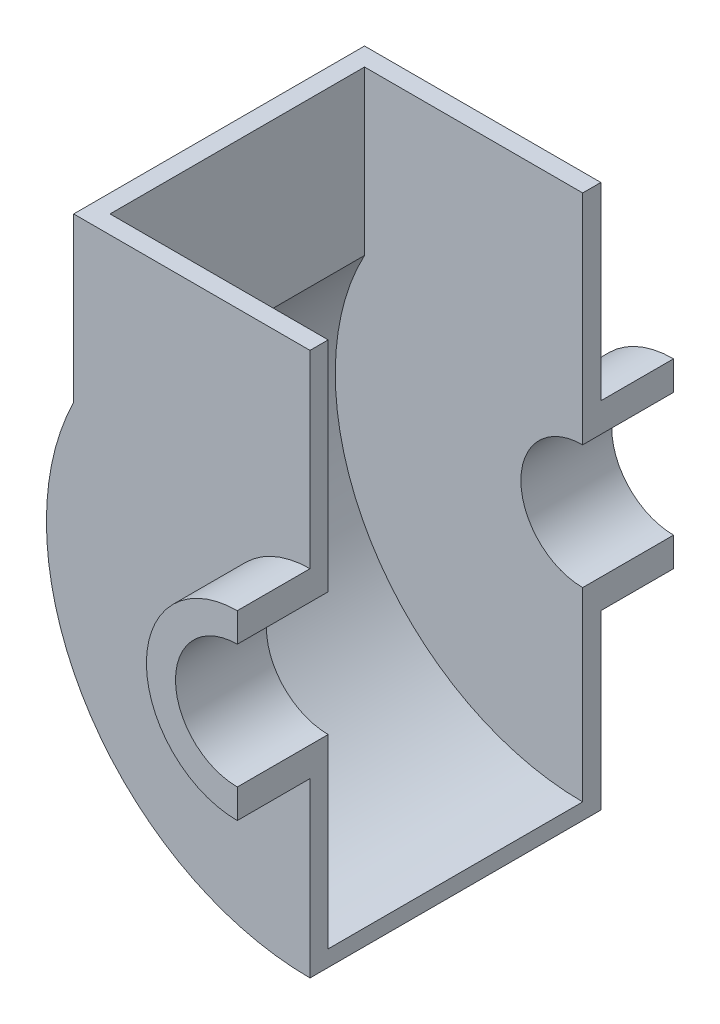
ISO-10303-21;
HEADER;
FILE_DESCRIPTION(('STEP AP214'),'2;1');
FILE_NAME('part.step','',(''),(''),'','','');
FILE_SCHEMA(('AUTOMOTIVE_DESIGN { 1 0 10303 214 1 1 1 1 }'));
ENDSEC;
DATA;
#1=APPLICATION_CONTEXT('core data for automotive mechanical design processes');
#2=APPLICATION_PROTOCOL_DEFINITION('international standard','automotive_design',2000,#1);
#3=PRODUCT_CONTEXT('',#1,'mechanical');
#4=PRODUCT('Part','Part','',(#3));
#5=PRODUCT_RELATED_PRODUCT_CATEGORY('part','',(#4));
#6=PRODUCT_DEFINITION_FORMATION('','',#4);
#7=PRODUCT_DEFINITION_CONTEXT('part definition',#1,'design');
#8=PRODUCT_DEFINITION('design','',#6,#7);
#9=PRODUCT_DEFINITION_SHAPE('','',#8);
#10=(LENGTH_UNIT() NAMED_UNIT(*) SI_UNIT(.MILLI.,.METRE.));
#11=(NAMED_UNIT(*) PLANE_ANGLE_UNIT() SI_UNIT($,.RADIAN.));
#12=(NAMED_UNIT(*) SI_UNIT($,.STERADIAN.) SOLID_ANGLE_UNIT());
#13=UNCERTAINTY_MEASURE_WITH_UNIT(LENGTH_MEASURE(1.E-05),#10,'distance_accuracy_value','');
#14=(GEOMETRIC_REPRESENTATION_CONTEXT(3) GLOBAL_UNCERTAINTY_ASSIGNED_CONTEXT((#13)) GLOBAL_UNIT_ASSIGNED_CONTEXT((#10,
#11,#12)) REPRESENTATION_CONTEXT('',''));
#15=CARTESIAN_POINT('',(0.,0.,0.));
#16=DIRECTION('',(0.,0.,1.));
#17=DIRECTION('',(1.,0.,0.));
#18=AXIS2_PLACEMENT_3D('',#15,#16,#17);
#19=CARTESIAN_POINT('',(0.,0.,-5.));
#20=DIRECTION('',(0.,0.,1.));
#21=DIRECTION('',(1.,0.,0.));
#22=AXIS2_PLACEMENT_3D('',#19,#20,#21);
#23=PLANE('',#22);
#24=CARTESIAN_POINT('',(0.,0.,-5.));
#25=DIRECTION('',(0.,0.,1.));
#26=DIRECTION('',(-1.,0.,0.));
#27=AXIS2_PLACEMENT_3D('',#24,#25,#26);
#28=CIRCLE('',#27,68.053287944081);
#29=CARTESIAN_POINT('',(-60.,32.1130814466628,-5.));
#30=VERTEX_POINT('',#29);
#31=CARTESIAN_POINT('',(0.,-68.053287944081,-5.));
#32=VERTEX_POINT('',#31);
#33=EDGE_CURVE('E196',#30,#32,#28,.T.);
#34=ORIENTED_EDGE('',*,*,#33,.F.);
#35=DIRECTION('',(0.,-1.,0.));
#36=VECTOR('',#35,1.);
#37=CARTESIAN_POINT('',(-60.,77.,-5.));
#38=LINE('',#37,#36);
#39=CARTESIAN_POINT('',(-60.,77.,-5.));
#40=VERTEX_POINT('',#39);
#41=EDGE_CURVE('E53',#40,#30,#38,.T.);
#42=ORIENTED_EDGE('',*,*,#41,.F.);
#43=DIRECTION('',(-1.,0.,0.));
#44=VECTOR('',#43,1.);
#45=CARTESIAN_POINT('',(0.,77.,-5.));
#46=LINE('',#45,#44);
#47=CARTESIAN_POINT('',(0.,77.,-5.));
#48=VERTEX_POINT('',#47);
#49=EDGE_CURVE('E212',#48,#40,#46,.T.);
#50=ORIENTED_EDGE('',*,*,#49,.F.);
#51=DIRECTION('',(0.,1.,0.));
#52=VECTOR('',#51,1.);
#53=CARTESIAN_POINT('',(0.,25.,-5.));
#54=LINE('',#53,#52);
#55=CARTESIAN_POINT('',(0.,17.,-5.));
#56=VERTEX_POINT('',#55);
#57=EDGE_CURVE('E253',#56,#48,#54,.T.);
#58=ORIENTED_EDGE('',*,*,#57,.F.);
#59=CARTESIAN_POINT('',(0.,0.,-5.));
#60=DIRECTION('',(0.,0.,-1.));
#61=DIRECTION('',(1.,0.,0.));
#62=AXIS2_PLACEMENT_3D('',#59,#60,#61);
#63=CIRCLE('',#62,17.);
#64=CARTESIAN_POINT('',(0.,-17.,-5.));
#65=VERTEX_POINT('',#64);
#66=EDGE_CURVE('E250',#65,#56,#63,.T.);
#67=ORIENTED_EDGE('',*,*,#66,.F.);
#68=DIRECTION('',(0.,1.,0.));
#69=VECTOR('',#68,1.);
#70=CARTESIAN_POINT('',(0.,-17.,-5.));
#71=LINE('',#70,#69);
#72=EDGE_CURVE('E59',#32,#65,#71,.T.);
#73=ORIENTED_EDGE('',*,*,#72,.F.);
#74=EDGE_LOOP('',(#34,#42,#50,#58,#67,#73));
#75=FACE_BOUND('',#74,.T.);
#76=ADVANCED_FACE('F36',(#75),#23,.F.);
#77=CARTESIAN_POINT('',(0.,0.,-5.));
#78=DIRECTION('',(0.,0.,1.));
#79=DIRECTION('',(1.,0.,0.));
#80=AXIS2_PLACEMENT_3D('',#77,#78,#79);
#81=CYLINDRICAL_SURFACE('',#80,17.);
#82=DIRECTION('',(0.,0.,1.));
#83=VECTOR('',#82,1.);
#84=CARTESIAN_POINT('',(0.,17.,-5.));
#85=LINE('',#84,#83);
#86=CARTESIAN_POINT('',(0.,17.,20.));
#87=VERTEX_POINT('',#86);
#88=EDGE_CURVE('E40',#56,#87,#85,.T.);
#89=ORIENTED_EDGE('',*,*,#88,.T.);
#90=CARTESIAN_POINT('',(0.,0.,20.));
#91=DIRECTION('',(0.,0.,-1.));
#92=DIRECTION('',(1.,0.,0.));
#93=AXIS2_PLACEMENT_3D('',#90,#91,#92);
#94=CIRCLE('',#93,17.);
#95=CARTESIAN_POINT('',(0.,-17.,20.));
#96=VERTEX_POINT('',#95);
#97=EDGE_CURVE('E233',#96,#87,#94,.T.);
#98=ORIENTED_EDGE('',*,*,#97,.F.);
#99=DIRECTION('',(0.,0.,1.));
#100=VECTOR('',#99,1.);
#101=CARTESIAN_POINT('',(0.,-17.,-5.));
#102=LINE('',#101,#100);
#103=EDGE_CURVE('E11',#65,#96,#102,.T.);
#104=ORIENTED_EDGE('',*,*,#103,.F.);
#105=ORIENTED_EDGE('',*,*,#66,.T.);
#106=EDGE_LOOP('',(#89,#98,#104,#105));
#107=FACE_BOUND('',#106,.T.);
#108=ADVANCED_FACE('F38',(#107),#81,.F.);
#109=CARTESIAN_POINT('',(0.,-17.,-5.));
#110=DIRECTION('',(1.,0.,0.));
#111=DIRECTION('',(0.,0.,-1.));
#112=AXIS2_PLACEMENT_3D('',#109,#110,#111);
#113=PLANE('',#112);
#114=ORIENTED_EDGE('',*,*,#103,.T.);
#115=DIRECTION('',(0.,1.,0.));
#116=VECTOR('',#115,1.);
#117=CARTESIAN_POINT('',(0.,-17.,20.));
#118=LINE('',#117,#116);
#119=CARTESIAN_POINT('',(0.,-25.,20.));
#120=VERTEX_POINT('',#119);
#121=EDGE_CURVE('E247',#120,#96,#118,.T.);
#122=ORIENTED_EDGE('',*,*,#121,.F.);
#123=DIRECTION('',(0.,0.,1.));
#124=VECTOR('',#123,1.);
#125=CARTESIAN_POINT('',(0.,-25.,-5.));
#126=LINE('',#125,#124);
#127=CARTESIAN_POINT('',(0.,-25.,0.));
#128=VERTEX_POINT('',#127);
#129=EDGE_CURVE('E45',#128,#120,#126,.T.);
#130=ORIENTED_EDGE('',*,*,#129,.F.);
#131=DIRECTION('',(0.,-1.,0.));
#132=VECTOR('',#131,1.);
#133=CARTESIAN_POINT('',(0.,0.,0.));
#134=LINE('',#133,#132);
#135=CARTESIAN_POINT('',(0.,-72.5,0.));
#136=VERTEX_POINT('',#135);
#137=EDGE_CURVE('E215',#128,#136,#134,.T.);
#138=ORIENTED_EDGE('',*,*,#137,.T.);
#139=DIRECTION('',(0.,0.,1.));
#140=VECTOR('',#139,1.);
#141=CARTESIAN_POINT('',(0.,-72.5,-5.));
#142=LINE('',#141,#140);
#143=CARTESIAN_POINT('',(0.,-72.5,-80.));
#144=VERTEX_POINT('',#143);
#145=EDGE_CURVE('E231',#144,#136,#142,.T.);
#146=ORIENTED_EDGE('',*,*,#145,.F.);
#147=DIRECTION('',(0.,-1.,0.));
#148=VECTOR('',#147,1.);
#149=CARTESIAN_POINT('',(0.,0.,-80.));
#150=LINE('',#149,#148);
#151=CARTESIAN_POINT('',(0.,-25.,-80.));
#152=VERTEX_POINT('',#151);
#153=EDGE_CURVE('E163',#152,#144,#150,.T.);
#154=ORIENTED_EDGE('',*,*,#153,.F.);
#155=DIRECTION('',(0.,0.,-1.));
#156=VECTOR('',#155,1.);
#157=CARTESIAN_POINT('',(0.,-25.,-75.));
#158=LINE('',#157,#156);
#159=CARTESIAN_POINT('',(0.,-25.,-100.));
#160=VERTEX_POINT('',#159);
#161=EDGE_CURVE('E189',#152,#160,#158,.T.);
#162=ORIENTED_EDGE('',*,*,#161,.T.);
#163=DIRECTION('',(0.,1.,0.));
#164=VECTOR('',#163,1.);
#165=CARTESIAN_POINT('',(0.,-17.,-100.));
#166=LINE('',#165,#164);
#167=CARTESIAN_POINT('',(0.,-17.,-100.));
#168=VERTEX_POINT('',#167);
#169=EDGE_CURVE('E182',#160,#168,#166,.T.);
#170=ORIENTED_EDGE('',*,*,#169,.T.);
#171=DIRECTION('',(0.,0.,-1.));
#172=VECTOR('',#171,1.);
#173=CARTESIAN_POINT('',(0.,-17.,-75.));
#174=LINE('',#173,#172);
#175=CARTESIAN_POINT('',(0.,-17.,-75.));
#176=VERTEX_POINT('',#175);
#177=EDGE_CURVE('E186',#176,#168,#174,.T.);
#178=ORIENTED_EDGE('',*,*,#177,.F.);
#179=DIRECTION('',(0.,1.,0.));
#180=VECTOR('',#179,1.);
#181=CARTESIAN_POINT('',(0.,-17.,-75.));
#182=LINE('',#181,#180);
#183=CARTESIAN_POINT('',(0.,-68.053287944081,-75.));
#184=VERTEX_POINT('',#183);
#185=EDGE_CURVE('E178',#184,#176,#182,.T.);
#186=ORIENTED_EDGE('',*,*,#185,.F.);
#187=DIRECTION('',(0.,0.,1.));
#188=VECTOR('',#187,1.);
#189=CARTESIAN_POINT('',(0.,-68.053287944081,-241.152038807834));
#190=LINE('',#189,#188);
#191=EDGE_CURVE('E199',#184,#32,#190,.T.);
#192=ORIENTED_EDGE('',*,*,#191,.T.);
#193=ORIENTED_EDGE('',*,*,#72,.T.);
#194=EDGE_LOOP('',(#114,#122,#130,#138,#146,#154,#162,#170,#178,#186,#192,#193));
#195=FACE_BOUND('',#194,.T.);
#196=ADVANCED_FACE('F271',(#195),#113,.T.);
#197=CARTESIAN_POINT('',(0.,0.,-5.));
#198=DIRECTION('',(0.,0.,1.));
#199=DIRECTION('',(1.,0.,0.));
#200=AXIS2_PLACEMENT_3D('',#197,#198,#199);
#201=CYLINDRICAL_SURFACE('',#200,25.);
#202=CARTESIAN_POINT('',(0.,0.,0.));
#203=DIRECTION('',(0.,0.,1.));
#204=DIRECTION('',(1.,0.,0.));
#205=AXIS2_PLACEMENT_3D('',#202,#203,#204);
#206=CIRCLE('',#205,25.);
#207=CARTESIAN_POINT('',(0.,25.,0.));
#208=VERTEX_POINT('',#207);
#209=EDGE_CURVE('E205',#208,#128,#206,.T.);
#210=ORIENTED_EDGE('',*,*,#209,.T.);
#211=ORIENTED_EDGE('',*,*,#129,.T.);
#212=CARTESIAN_POINT('',(0.,0.,20.));
#213=DIRECTION('',(0.,0.,1.));
#214=DIRECTION('',(1.,0.,0.));
#215=AXIS2_PLACEMENT_3D('',#212,#213,#214);
#216=CIRCLE('',#215,25.);
#217=CARTESIAN_POINT('',(0.,25.,20.));
#218=VERTEX_POINT('',#217);
#219=EDGE_CURVE('E244',#218,#120,#216,.T.);
#220=ORIENTED_EDGE('',*,*,#219,.F.);
#221=DIRECTION('',(0.,0.,1.));
#222=VECTOR('',#221,1.);
#223=CARTESIAN_POINT('',(0.,25.,-5.));
#224=LINE('',#223,#222);
#225=EDGE_CURVE('E256',#208,#218,#224,.T.);
#226=ORIENTED_EDGE('',*,*,#225,.F.);
#227=EDGE_LOOP('',(#210,#211,#220,#226));
#228=FACE_BOUND('',#227,.T.);
#229=ADVANCED_FACE('F279',(#228),#201,.T.);
#230=CARTESIAN_POINT('',(0.,25.,-5.));
#231=DIRECTION('',(1.,0.,0.));
#232=DIRECTION('',(0.,0.,-1.));
#233=AXIS2_PLACEMENT_3D('',#230,#231,#232);
#234=PLANE('',#233);
#235=ORIENTED_EDGE('',*,*,#57,.T.);
#236=DIRECTION('',(0.,0.,1.));
#237=VECTOR('',#236,1.);
#238=CARTESIAN_POINT('',(0.,77.,-5.));
#239=LINE('',#238,#237);
#240=CARTESIAN_POINT('',(0.,77.,0.));
#241=VERTEX_POINT('',#240);
#242=EDGE_CURVE('E214',#48,#241,#239,.T.);
#243=ORIENTED_EDGE('',*,*,#242,.T.);
#244=DIRECTION('',(0.,1.,0.));
#245=VECTOR('',#244,1.);
#246=CARTESIAN_POINT('',(0.,0.,0.));
#247=LINE('',#246,#245);
#248=EDGE_CURVE('E217',#208,#241,#247,.T.);
#249=ORIENTED_EDGE('',*,*,#248,.F.);
#250=ORIENTED_EDGE('',*,*,#225,.T.);
#251=DIRECTION('',(0.,1.,0.));
#252=VECTOR('',#251,1.);
#253=CARTESIAN_POINT('',(0.,25.,20.));
#254=LINE('',#253,#252);
#255=EDGE_CURVE('E241',#87,#218,#254,.T.);
#256=ORIENTED_EDGE('',*,*,#255,.F.);
#257=ORIENTED_EDGE('',*,*,#88,.F.);
#258=EDGE_LOOP('',(#235,#243,#249,#250,#256,#257));
#259=FACE_BOUND('',#258,.T.);
#260=ADVANCED_FACE('F264',(#259),#234,.T.);
#261=CARTESIAN_POINT('',(0.,0.,20.));
#262=DIRECTION('',(0.,0.,1.));
#263=DIRECTION('',(1.,0.,0.));
#264=AXIS2_PLACEMENT_3D('',#261,#262,#263);
#265=PLANE('',#264);
#266=ORIENTED_EDGE('',*,*,#97,.T.);
#267=ORIENTED_EDGE('',*,*,#255,.T.);
#268=ORIENTED_EDGE('',*,*,#219,.T.);
#269=ORIENTED_EDGE('',*,*,#121,.T.);
#270=EDGE_LOOP('',(#266,#267,#268,#269));
#271=FACE_BOUND('',#270,.T.);
#272=ADVANCED_FACE('F267',(#271),#265,.T.);
#273=CARTESIAN_POINT('',(0.,0.,-5.));
#274=DIRECTION('',(0.,0.,1.));
#275=DIRECTION('',(1.,0.,0.));
#276=AXIS2_PLACEMENT_3D('',#273,#274,#275);
#277=CYLINDRICAL_SURFACE('',#276,72.5);
#278=CARTESIAN_POINT('',(0.,0.,0.));
#279=DIRECTION('',(0.,0.,1.));
#280=DIRECTION('',(1.,0.,0.));
#281=AXIS2_PLACEMENT_3D('',#278,#279,#280);
#282=CIRCLE('',#281,72.5);
#283=CARTESIAN_POINT('',(-65.,32.1130814466628,0.));
#284=VERTEX_POINT('',#283);
#285=EDGE_CURVE('E226',#284,#136,#282,.T.);
#286=ORIENTED_EDGE('',*,*,#285,.F.);
#287=DIRECTION('',(0.,0.,1.));
#288=VECTOR('',#287,1.);
#289=CARTESIAN_POINT('',(-65.,32.1130814466628,-5.));
#290=LINE('',#289,#288);
#291=CARTESIAN_POINT('',(-65.,32.1130814466628,-80.));
#292=VERTEX_POINT('',#291);
#293=EDGE_CURVE('E234',#292,#284,#290,.T.);
#294=ORIENTED_EDGE('',*,*,#293,.F.);
#295=CARTESIAN_POINT('',(0.,0.,-80.));
#296=DIRECTION('',(0.,0.,1.));
#297=DIRECTION('',(1.,0.,0.));
#298=AXIS2_PLACEMENT_3D('',#295,#296,#297);
#299=CIRCLE('',#298,72.5);
#300=EDGE_CURVE('E347',#292,#144,#299,.T.);
#301=ORIENTED_EDGE('',*,*,#300,.T.);
#302=ORIENTED_EDGE('',*,*,#145,.T.);
#303=EDGE_LOOP('',(#286,#294,#301,#302));
#304=FACE_BOUND('',#303,.T.);
#305=ADVANCED_FACE('F295',(#304),#277,.T.);
#306=CARTESIAN_POINT('',(-65.,0.,-5.));
#307=DIRECTION('',(-1.,0.,0.));
#308=DIRECTION('',(0.,0.,1.));
#309=AXIS2_PLACEMENT_3D('',#306,#307,#308);
#310=PLANE('',#309);
#311=DIRECTION('',(0.,-1.,0.));
#312=VECTOR('',#311,1.);
#313=CARTESIAN_POINT('',(-65.,0.,0.));
#314=LINE('',#313,#312);
#315=CARTESIAN_POINT('',(-65.,77.,0.));
#316=VERTEX_POINT('',#315);
#317=EDGE_CURVE('E223',#316,#284,#314,.T.);
#318=ORIENTED_EDGE('',*,*,#317,.F.);
#319=DIRECTION('',(0.,0.,1.));
#320=VECTOR('',#319,1.);
#321=CARTESIAN_POINT('',(-65.,77.,-5.));
#322=LINE('',#321,#320);
#323=CARTESIAN_POINT('',(-65.,77.,-80.));
#324=VERTEX_POINT('',#323);
#325=EDGE_CURVE('E236',#324,#316,#322,.T.);
#326=ORIENTED_EDGE('',*,*,#325,.F.);
#327=DIRECTION('',(0.,-1.,0.));
#328=VECTOR('',#327,1.);
#329=CARTESIAN_POINT('',(-65.,0.,-80.));
#330=LINE('',#329,#328);
#331=EDGE_CURVE('E349',#324,#292,#330,.T.);
#332=ORIENTED_EDGE('',*,*,#331,.T.);
#333=ORIENTED_EDGE('',*,*,#293,.T.);
#334=EDGE_LOOP('',(#318,#326,#332,#333));
#335=FACE_BOUND('',#334,.T.);
#336=ADVANCED_FACE('F298',(#335),#310,.T.);
#337=CARTESIAN_POINT('',(0.,77.,-5.));
#338=DIRECTION('',(0.,1.,0.));
#339=DIRECTION('',(-1.,0.,0.));
#340=AXIS2_PLACEMENT_3D('',#337,#338,#339);
#341=PLANE('',#340);
#342=DIRECTION('',(-1.,0.,0.));
#343=VECTOR('',#342,1.);
#344=CARTESIAN_POINT('',(0.,77.,0.));
#345=LINE('',#344,#343);
#346=EDGE_CURVE('E220',#241,#316,#345,.T.);
#347=ORIENTED_EDGE('',*,*,#346,.F.);
#348=ORIENTED_EDGE('',*,*,#242,.F.);
#349=ORIENTED_EDGE('',*,*,#49,.T.);
#350=DIRECTION('',(0.,0.,1.));
#351=VECTOR('',#350,1.);
#352=CARTESIAN_POINT('',(-60.,77.,-241.152038807834));
#353=LINE('',#352,#351);
#354=CARTESIAN_POINT('',(-60.,77.,-75.0000000000001));
#355=VERTEX_POINT('',#354);
#356=EDGE_CURVE('E159',#355,#40,#353,.T.);
#357=ORIENTED_EDGE('',*,*,#356,.F.);
#358=DIRECTION('',(-1.,0.,0.));
#359=VECTOR('',#358,1.);
#360=CARTESIAN_POINT('',(0.,77.,-75.));
#361=LINE('',#360,#359);
#362=CARTESIAN_POINT('',(0.,77.,-75.));
#363=VERTEX_POINT('',#362);
#364=EDGE_CURVE('E151',#363,#355,#361,.T.);
#365=ORIENTED_EDGE('',*,*,#364,.F.);
#366=DIRECTION('',(0.,0.,-1.));
#367=VECTOR('',#366,1.);
#368=CARTESIAN_POINT('',(0.,77.,-75.));
#369=LINE('',#368,#367);
#370=CARTESIAN_POINT('',(0.,77.,-80.));
#371=VERTEX_POINT('',#370);
#372=EDGE_CURVE('E156',#363,#371,#369,.T.);
#373=ORIENTED_EDGE('',*,*,#372,.T.);
#374=DIRECTION('',(-1.,0.,0.));
#375=VECTOR('',#374,1.);
#376=CARTESIAN_POINT('',(0.,77.,-80.));
#377=LINE('',#376,#375);
#378=EDGE_CURVE('E363',#371,#324,#377,.T.);
#379=ORIENTED_EDGE('',*,*,#378,.T.);
#380=ORIENTED_EDGE('',*,*,#325,.T.);
#381=EDGE_LOOP('',(#347,#348,#349,#357,#365,#373,#379,#380));
#382=FACE_BOUND('',#381,.T.);
#383=ADVANCED_FACE('F154',(#382),#341,.T.);
#384=CARTESIAN_POINT('',(0.,0.,0.));
#385=DIRECTION('',(0.,0.,1.));
#386=DIRECTION('',(1.,0.,0.));
#387=AXIS2_PLACEMENT_3D('',#384,#385,#386);
#388=PLANE('',#387);
#389=ORIENTED_EDGE('',*,*,#209,.F.);
#390=ORIENTED_EDGE('',*,*,#248,.T.);
#391=ORIENTED_EDGE('',*,*,#346,.T.);
#392=ORIENTED_EDGE('',*,*,#317,.T.);
#393=ORIENTED_EDGE('',*,*,#285,.T.);
#394=ORIENTED_EDGE('',*,*,#137,.F.);
#395=EDGE_LOOP('',(#389,#390,#391,#392,#393,#394));
#396=FACE_BOUND('',#395,.T.);
#397=ADVANCED_FACE('F277',(#396),#388,.T.);
#398=CARTESIAN_POINT('',(-60.,77.,-241.152038807834));
#399=DIRECTION('',(-1.,0.,0.));
#400=DIRECTION('',(0.,-1.,0.));
#401=AXIS2_PLACEMENT_3D('',#398,#399,#400);
#402=PLANE('',#401);
#403=DIRECTION('',(0.,-1.,0.));
#404=VECTOR('',#403,1.);
#405=CARTESIAN_POINT('',(-60.,77.,-75.));
#406=LINE('',#405,#404);
#407=CARTESIAN_POINT('',(-60.,32.1130814466628,-75.0000000000001));
#408=VERTEX_POINT('',#407);
#409=EDGE_CURVE('E206',#355,#408,#406,.T.);
#410=ORIENTED_EDGE('',*,*,#409,.F.);
#411=ORIENTED_EDGE('',*,*,#356,.T.);
#412=ORIENTED_EDGE('',*,*,#41,.T.);
#413=DIRECTION('',(0.,0.,1.));
#414=VECTOR('',#413,1.);
#415=CARTESIAN_POINT('',(-60.,32.1130814466628,-241.152038807834));
#416=LINE('',#415,#414);
#417=EDGE_CURVE('E200',#408,#30,#416,.T.);
#418=ORIENTED_EDGE('',*,*,#417,.F.);
#419=EDGE_LOOP('',(#410,#411,#412,#418));
#420=FACE_BOUND('',#419,.T.);
#421=ADVANCED_FACE('F307',(#420),#402,.F.);
#422=CARTESIAN_POINT('',(0.,0.,-241.152038807834));
#423=DIRECTION('',(0.,0.,1.));
#424=DIRECTION('',(1.,0.,0.));
#425=AXIS2_PLACEMENT_3D('',#422,#423,#424);
#426=CYLINDRICAL_SURFACE('',#425,68.053287944081);
#427=CARTESIAN_POINT('',(0.,0.,-75.));
#428=DIRECTION('',(0.,0.,-1.));
#429=DIRECTION('',(-1.,0.,0.));
#430=AXIS2_PLACEMENT_3D('',#427,#428,#429);
#431=CIRCLE('',#430,68.053287944081);
#432=EDGE_CURVE('E202',#408,#184,#431,.F.);
#433=ORIENTED_EDGE('',*,*,#432,.F.);
#434=ORIENTED_EDGE('',*,*,#417,.T.);
#435=ORIENTED_EDGE('',*,*,#33,.T.);
#436=ORIENTED_EDGE('',*,*,#191,.F.);
#437=EDGE_LOOP('',(#433,#434,#435,#436));
#438=FACE_BOUND('',#437,.T.);
#439=ADVANCED_FACE('F310',(#438),#426,.F.);
#440=CARTESIAN_POINT('',(0.,0.,-75.));
#441=DIRECTION('',(0.,0.,-1.));
#442=DIRECTION('',(1.,0.,0.));
#443=AXIS2_PLACEMENT_3D('',#440,#441,#442);
#444=PLANE('',#443);
#445=ORIENTED_EDGE('',*,*,#364,.T.);
#446=ORIENTED_EDGE('',*,*,#409,.T.);
#447=ORIENTED_EDGE('',*,*,#432,.T.);
#448=ORIENTED_EDGE('',*,*,#185,.T.);
#449=CARTESIAN_POINT('',(0.,0.,-75.));
#450=DIRECTION('',(0.,0.,-1.));
#451=DIRECTION('',(1.,0.,0.));
#452=AXIS2_PLACEMENT_3D('',#449,#450,#451);
#453=CIRCLE('',#452,17.);
#454=CARTESIAN_POINT('',(0.,17.,-75.));
#455=VERTEX_POINT('',#454);
#456=EDGE_CURVE('E176',#176,#455,#453,.T.);
#457=ORIENTED_EDGE('',*,*,#456,.T.);
#458=DIRECTION('',(0.,1.,0.));
#459=VECTOR('',#458,1.);
#460=CARTESIAN_POINT('',(0.,25.,-75.));
#461=LINE('',#460,#459);
#462=EDGE_CURVE('E168',#455,#363,#461,.T.);
#463=ORIENTED_EDGE('',*,*,#462,.T.);
#464=EDGE_LOOP('',(#445,#446,#447,#448,#457,#463));
#465=FACE_BOUND('',#464,.T.);
#466=ADVANCED_FACE('F174',(#465),#444,.F.);
#467=CARTESIAN_POINT('',(0.,0.,-75.));
#468=DIRECTION('',(0.,0.,-1.));
#469=DIRECTION('',(1.,0.,0.));
#470=AXIS2_PLACEMENT_3D('',#467,#468,#469);
#471=CYLINDRICAL_SURFACE('',#470,17.);
#472=DIRECTION('',(0.,0.,-1.));
#473=VECTOR('',#472,1.);
#474=CARTESIAN_POINT('',(0.,17.,-75.));
#475=LINE('',#474,#473);
#476=CARTESIAN_POINT('',(0.,17.,-100.));
#477=VERTEX_POINT('',#476);
#478=EDGE_CURVE('E180',#455,#477,#475,.T.);
#479=ORIENTED_EDGE('',*,*,#478,.F.);
#480=ORIENTED_EDGE('',*,*,#456,.F.);
#481=ORIENTED_EDGE('',*,*,#177,.T.);
#482=CARTESIAN_POINT('',(0.,0.,-100.));
#483=DIRECTION('',(0.,0.,-1.));
#484=DIRECTION('',(1.,0.,0.));
#485=AXIS2_PLACEMENT_3D('',#482,#483,#484);
#486=CIRCLE('',#485,17.);
#487=EDGE_CURVE('E172',#168,#477,#486,.T.);
#488=ORIENTED_EDGE('',*,*,#487,.T.);
#489=EDGE_LOOP('',(#479,#480,#481,#488));
#490=FACE_BOUND('',#489,.T.);
#491=ADVANCED_FACE('F315',(#490),#471,.F.);
#492=CARTESIAN_POINT('',(0.,0.,-75.));
#493=DIRECTION('',(0.,0.,-1.));
#494=DIRECTION('',(1.,0.,0.));
#495=AXIS2_PLACEMENT_3D('',#492,#493,#494);
#496=CYLINDRICAL_SURFACE('',#495,25.);
#497=CARTESIAN_POINT('',(0.,0.,-80.));
#498=DIRECTION('',(0.,0.,1.));
#499=DIRECTION('',(1.,0.,0.));
#500=AXIS2_PLACEMENT_3D('',#497,#498,#499);
#501=CIRCLE('',#500,25.);
#502=CARTESIAN_POINT('',(0.,25.,-80.));
#503=VERTEX_POINT('',#502);
#504=EDGE_CURVE('E338',#503,#152,#501,.T.);
#505=ORIENTED_EDGE('',*,*,#504,.F.);
#506=DIRECTION('',(0.,0.,-1.));
#507=VECTOR('',#506,1.);
#508=CARTESIAN_POINT('',(0.,25.,-75.));
#509=LINE('',#508,#507);
#510=CARTESIAN_POINT('',(0.,25.,-100.));
#511=VERTEX_POINT('',#510);
#512=EDGE_CURVE('E192',#503,#511,#509,.T.);
#513=ORIENTED_EDGE('',*,*,#512,.T.);
#514=CARTESIAN_POINT('',(0.,0.,-100.));
#515=DIRECTION('',(0.,0.,1.));
#516=DIRECTION('',(1.,0.,0.));
#517=AXIS2_PLACEMENT_3D('',#514,#515,#516);
#518=CIRCLE('',#517,25.);
#519=EDGE_CURVE('E344',#511,#160,#518,.T.);
#520=ORIENTED_EDGE('',*,*,#519,.T.);
#521=ORIENTED_EDGE('',*,*,#161,.F.);
#522=EDGE_LOOP('',(#505,#513,#520,#521));
#523=FACE_BOUND('',#522,.T.);
#524=ADVANCED_FACE('F318',(#523),#496,.T.);
#525=CARTESIAN_POINT('',(0.,25.,-75.));
#526=DIRECTION('',(1.,0.,0.));
#527=DIRECTION('',(0.,0.,1.));
#528=AXIS2_PLACEMENT_3D('',#525,#526,#527);
#529=PLANE('',#528);
#530=ORIENTED_EDGE('',*,*,#462,.F.);
#531=ORIENTED_EDGE('',*,*,#478,.T.);
#532=DIRECTION('',(0.,1.,0.));
#533=VECTOR('',#532,1.);
#534=CARTESIAN_POINT('',(0.,25.,-100.));
#535=LINE('',#534,#533);
#536=EDGE_CURVE('E355',#477,#511,#535,.T.);
#537=ORIENTED_EDGE('',*,*,#536,.T.);
#538=ORIENTED_EDGE('',*,*,#512,.F.);
#539=DIRECTION('',(0.,1.,0.));
#540=VECTOR('',#539,1.);
#541=CARTESIAN_POINT('',(0.,0.,-80.));
#542=LINE('',#541,#540);
#543=EDGE_CURVE('E171',#503,#371,#542,.T.);
#544=ORIENTED_EDGE('',*,*,#543,.T.);
#545=ORIENTED_EDGE('',*,*,#372,.F.);
#546=EDGE_LOOP('',(#530,#531,#537,#538,#544,#545));
#547=FACE_BOUND('',#546,.T.);
#548=ADVANCED_FACE('F166',(#547),#529,.T.);
#549=CARTESIAN_POINT('',(0.,0.,-100.));
#550=DIRECTION('',(0.,0.,-1.));
#551=DIRECTION('',(1.,0.,0.));
#552=AXIS2_PLACEMENT_3D('',#549,#550,#551);
#553=PLANE('',#552);
#554=ORIENTED_EDGE('',*,*,#487,.F.);
#555=ORIENTED_EDGE('',*,*,#169,.F.);
#556=ORIENTED_EDGE('',*,*,#519,.F.);
#557=ORIENTED_EDGE('',*,*,#536,.F.);
#558=EDGE_LOOP('',(#554,#555,#556,#557));
#559=FACE_BOUND('',#558,.T.);
#560=ADVANCED_FACE('F322',(#559),#553,.T.);
#561=CARTESIAN_POINT('',(0.,0.,-80.));
#562=DIRECTION('',(0.,0.,-1.));
#563=DIRECTION('',(1.,0.,0.));
#564=AXIS2_PLACEMENT_3D('',#561,#562,#563);
#565=PLANE('',#564);
#566=ORIENTED_EDGE('',*,*,#504,.T.);
#567=ORIENTED_EDGE('',*,*,#153,.T.);
#568=ORIENTED_EDGE('',*,*,#300,.F.);
#569=ORIENTED_EDGE('',*,*,#331,.F.);
#570=ORIENTED_EDGE('',*,*,#378,.F.);
#571=ORIENTED_EDGE('',*,*,#543,.F.);
#572=EDGE_LOOP('',(#566,#567,#568,#569,#570,#571));
#573=FACE_BOUND('',#572,.T.);
#574=ADVANCED_FACE('F330',(#573),#565,.T.);
#575=CLOSED_SHELL('',(#76,#108,#196,#229,#260,#272,#305,#336,#383,#397,#421,#439,#466,#491,#524,
#548,#560,#574));
#576=MANIFOLD_SOLID_BREP('B2',#575);
#577=ADVANCED_BREP_SHAPE_REPRESENTATION('',(#18,#576),#14);
#578=SHAPE_DEFINITION_REPRESENTATION(#9,#577);
ENDSEC;
END-ISO-10303-21;
